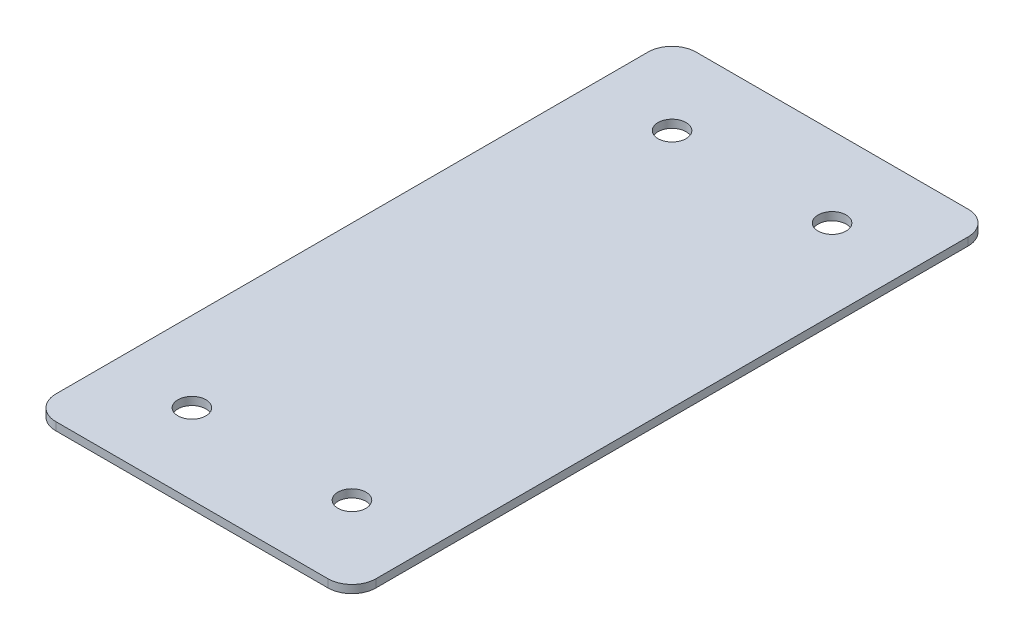
ISO-10303-21;
HEADER;
FILE_DESCRIPTION(('STEP AP214'),'2;1');
FILE_NAME('part.step','',(''),(''),'','','');
FILE_SCHEMA(('AUTOMOTIVE_DESIGN { 1 0 10303 214 1 1 1 1 }'));
ENDSEC;
DATA;
#1=APPLICATION_CONTEXT('core data for automotive mechanical design processes');
#2=APPLICATION_PROTOCOL_DEFINITION('international standard','automotive_design',2000,#1);
#3=PRODUCT_CONTEXT('',#1,'mechanical');
#4=PRODUCT('Part','Part','',(#3));
#5=PRODUCT_RELATED_PRODUCT_CATEGORY('part','',(#4));
#6=PRODUCT_DEFINITION_FORMATION('','',#4);
#7=PRODUCT_DEFINITION_CONTEXT('part definition',#1,'design');
#8=PRODUCT_DEFINITION('design','',#6,#7);
#9=PRODUCT_DEFINITION_SHAPE('','',#8);
#10=(LENGTH_UNIT() NAMED_UNIT(*) SI_UNIT(.MILLI.,.METRE.));
#11=(NAMED_UNIT(*) PLANE_ANGLE_UNIT() SI_UNIT($,.RADIAN.));
#12=(NAMED_UNIT(*) SI_UNIT($,.STERADIAN.) SOLID_ANGLE_UNIT());
#13=UNCERTAINTY_MEASURE_WITH_UNIT(LENGTH_MEASURE(1.E-05),#10,'distance_accuracy_value','');
#14=(GEOMETRIC_REPRESENTATION_CONTEXT(3) GLOBAL_UNCERTAINTY_ASSIGNED_CONTEXT((#13)) GLOBAL_UNIT_ASSIGNED_CONTEXT((#10,
#11,#12)) REPRESENTATION_CONTEXT('',''));
#15=CARTESIAN_POINT('',(0.,0.,0.));
#16=DIRECTION('',(0.,0.,1.));
#17=DIRECTION('',(1.,0.,0.));
#18=AXIS2_PLACEMENT_3D('',#15,#16,#17);
#19=CARTESIAN_POINT('',(0.,1.,0.));
#20=DIRECTION('',(0.,1.,0.));
#21=DIRECTION('',(0.,0.,1.));
#22=AXIS2_PLACEMENT_3D('',#19,#20,#21);
#23=PLANE('',#22);
#24=CARTESIAN_POINT('',(10.2814161229713,1.,30.9206525123638));
#25=DIRECTION('',(0.,1.,0.));
#26=DIRECTION('',(0.,0.,1.));
#27=AXIS2_PLACEMENT_3D('',#24,#25,#26);
#28=CIRCLE('',#27,1.75);
#29=CARTESIAN_POINT('',(10.2814161229713,1.,32.6706525123638));
#30=VERTEX_POINT('',#29);
#31=EDGE_CURVE('E188',#30,#30,#28,.T.);
#32=ORIENTED_EDGE('',*,*,#31,.F.);
#33=EDGE_LOOP('',(#32));
#34=FACE_BOUND('',#33,.T.);
#35=CARTESIAN_POINT('',(-9.71858387702875,1.,-29.0793474876362));
#36=DIRECTION('',(0.,1.,0.));
#37=DIRECTION('',(0.,0.,1.));
#38=AXIS2_PLACEMENT_3D('',#35,#36,#37);
#39=CIRCLE('',#38,1.75);
#40=CARTESIAN_POINT('',(-9.71858387702875,1.,-27.3293474876362));
#41=VERTEX_POINT('',#40);
#42=EDGE_CURVE('E134',#41,#41,#39,.T.);
#43=ORIENTED_EDGE('',*,*,#42,.F.);
#44=EDGE_LOOP('',(#43));
#45=FACE_BOUND('',#44,.T.);
#46=DIRECTION('',(-1.,0.,0.));
#47=VECTOR('',#46,1.);
#48=CARTESIAN_POINT('',(20.2814161229713,1.,-39.0793474876362));
#49=LINE('',#48,#47);
#50=CARTESIAN_POINT('',(17.2814161229713,1.,-39.0793474876362));
#51=VERTEX_POINT('',#50);
#52=CARTESIAN_POINT('',(-16.7185838770287,1.,-39.0793474876362));
#53=VERTEX_POINT('',#52);
#54=EDGE_CURVE('E139',#51,#53,#49,.T.);
#55=ORIENTED_EDGE('',*,*,#54,.T.);
#56=CARTESIAN_POINT('',(-16.7185838770288,1.,-36.0793474876362));
#57=DIRECTION('',(0.,1.,0.));
#58=DIRECTION('',(0.,0.,1.));
#59=AXIS2_PLACEMENT_3D('',#56,#57,#58);
#60=CIRCLE('',#59,3.);
#61=CARTESIAN_POINT('',(-19.7185838770288,1.,-36.0793474876362));
#62=VERTEX_POINT('',#61);
#63=EDGE_CURVE('E154',#53,#62,#60,.T.);
#64=ORIENTED_EDGE('',*,*,#63,.T.);
#65=DIRECTION('',(0.,0.,1.));
#66=VECTOR('',#65,1.);
#67=CARTESIAN_POINT('',(-19.7185838770288,1.,-39.0793474876362));
#68=LINE('',#67,#66);
#69=CARTESIAN_POINT('',(-19.7185838770288,1.,37.9206525123638));
#70=VERTEX_POINT('',#69);
#71=EDGE_CURVE('E121',#62,#70,#68,.T.);
#72=ORIENTED_EDGE('',*,*,#71,.T.);
#73=CARTESIAN_POINT('',(-16.7185838770288,1.,37.9206525123638));
#74=DIRECTION('',(0.,1.,0.));
#75=DIRECTION('',(0.,0.,1.));
#76=AXIS2_PLACEMENT_3D('',#73,#74,#75);
#77=CIRCLE('',#76,3.);
#78=CARTESIAN_POINT('',(-16.7185838770288,1.,40.9206525123638));
#79=VERTEX_POINT('',#78);
#80=EDGE_CURVE('E149',#70,#79,#77,.T.);
#81=ORIENTED_EDGE('',*,*,#80,.T.);
#82=DIRECTION('',(1.,0.,0.));
#83=VECTOR('',#82,1.);
#84=CARTESIAN_POINT('',(-19.7185838770288,1.,40.9206525123638));
#85=LINE('',#84,#83);
#86=CARTESIAN_POINT('',(17.2814161229713,1.,40.9206525123638));
#87=VERTEX_POINT('',#86);
#88=EDGE_CURVE('E165',#79,#87,#85,.T.);
#89=ORIENTED_EDGE('',*,*,#88,.T.);
#90=CARTESIAN_POINT('',(17.2814161229713,1.,37.9206525123638));
#91=DIRECTION('',(0.,1.,0.));
#92=DIRECTION('',(0.,0.,1.));
#93=AXIS2_PLACEMENT_3D('',#90,#91,#92);
#94=CIRCLE('',#93,3.);
#95=CARTESIAN_POINT('',(20.2814161229713,1.,37.9206525123638));
#96=VERTEX_POINT('',#95);
#97=EDGE_CURVE('E57',#87,#96,#94,.T.);
#98=ORIENTED_EDGE('',*,*,#97,.T.);
#99=DIRECTION('',(0.,0.,-1.));
#100=VECTOR('',#99,1.);
#101=CARTESIAN_POINT('',(20.2814161229713,1.,40.9206525123638));
#102=LINE('',#101,#100);
#103=CARTESIAN_POINT('',(20.2814161229713,1.,-36.0793474876362));
#104=VERTEX_POINT('',#103);
#105=EDGE_CURVE('E140',#96,#104,#102,.T.);
#106=ORIENTED_EDGE('',*,*,#105,.T.);
#107=CARTESIAN_POINT('',(17.2814161229713,1.,-36.0793474876362));
#108=DIRECTION('',(0.,1.,0.));
#109=DIRECTION('',(0.,0.,1.));
#110=AXIS2_PLACEMENT_3D('',#107,#108,#109);
#111=CIRCLE('',#110,3.);
#112=EDGE_CURVE('E152',#104,#51,#111,.T.);
#113=ORIENTED_EDGE('',*,*,#112,.T.);
#114=EDGE_LOOP('',(#55,#64,#72,#81,#89,#98,#106,#113));
#115=FACE_BOUND('',#114,.T.);
#116=CARTESIAN_POINT('',(10.2814161229713,1.,-29.0793474876362));
#117=DIRECTION('',(0.,1.,0.));
#118=DIRECTION('',(0.,0.,-1.));
#119=AXIS2_PLACEMENT_3D('',#116,#117,#118);
#120=CIRCLE('',#119,1.75);
#121=CARTESIAN_POINT('',(10.2814161229713,1.,-30.8293474876362));
#122=VERTEX_POINT('',#121);
#123=EDGE_CURVE('E182',#122,#122,#120,.T.);
#124=ORIENTED_EDGE('',*,*,#123,.F.);
#125=EDGE_LOOP('',(#124));
#126=FACE_BOUND('',#125,.T.);
#127=CARTESIAN_POINT('',(-9.71858387702875,1.,30.9206525123638));
#128=DIRECTION('',(0.,1.,0.));
#129=DIRECTION('',(0.,0.,-1.));
#130=AXIS2_PLACEMENT_3D('',#127,#128,#129);
#131=CIRCLE('',#130,1.75);
#132=CARTESIAN_POINT('',(-9.71858387702875,1.,29.1706525123638));
#133=VERTEX_POINT('',#132);
#134=EDGE_CURVE('E194',#133,#133,#131,.T.);
#135=ORIENTED_EDGE('',*,*,#134,.F.);
#136=EDGE_LOOP('',(#135));
#137=FACE_BOUND('',#136,.T.);
#138=ADVANCED_FACE('F35',(#34,#45,#115,#126,#137),#23,.T.);
#139=CARTESIAN_POINT('',(0.,0.,0.));
#140=DIRECTION('',(0.,1.,0.));
#141=DIRECTION('',(0.,0.,1.));
#142=AXIS2_PLACEMENT_3D('',#139,#140,#141);
#143=PLANE('',#142);
#144=DIRECTION('',(0.,0.,1.));
#145=VECTOR('',#144,1.);
#146=CARTESIAN_POINT('',(-19.7185838770288,0.,-39.0793474876362));
#147=LINE('',#146,#145);
#148=CARTESIAN_POINT('',(-19.7185838770288,0.,-36.0793474876362));
#149=VERTEX_POINT('',#148);
#150=CARTESIAN_POINT('',(-19.7185838770288,0.,37.9206525123638));
#151=VERTEX_POINT('',#150);
#152=EDGE_CURVE('E118',#149,#151,#147,.T.);
#153=ORIENTED_EDGE('',*,*,#152,.F.);
#154=CARTESIAN_POINT('',(-16.7185838770288,0.,-36.0793474876362));
#155=DIRECTION('',(0.,1.,0.));
#156=DIRECTION('',(0.,0.,1.));
#157=AXIS2_PLACEMENT_3D('',#154,#155,#156);
#158=CIRCLE('',#157,3.);
#159=CARTESIAN_POINT('',(-16.7185838770287,0.,-39.0793474876362));
#160=VERTEX_POINT('',#159);
#161=EDGE_CURVE('E101',#149,#160,#158,.F.);
#162=ORIENTED_EDGE('',*,*,#161,.T.);
#163=DIRECTION('',(-1.,0.,0.));
#164=VECTOR('',#163,1.);
#165=CARTESIAN_POINT('',(0.281416122971253,0.,-39.0793474876362));
#166=LINE('',#165,#164);
#167=CARTESIAN_POINT('',(17.2814161229712,0.,-39.0793474876362));
#168=VERTEX_POINT('',#167);
#169=EDGE_CURVE('E129',#168,#160,#166,.T.);
#170=ORIENTED_EDGE('',*,*,#169,.F.);
#171=CARTESIAN_POINT('',(17.2814161229713,0.,-36.0793474876362));
#172=DIRECTION('',(0.,1.,0.));
#173=DIRECTION('',(0.,0.,1.));
#174=AXIS2_PLACEMENT_3D('',#171,#172,#173);
#175=CIRCLE('',#174,3.);
#176=CARTESIAN_POINT('',(20.2814161229713,0.,-36.0793474876362));
#177=VERTEX_POINT('',#176);
#178=EDGE_CURVE('E112',#168,#177,#175,.F.);
#179=ORIENTED_EDGE('',*,*,#178,.T.);
#180=DIRECTION('',(0.,0.,-1.));
#181=VECTOR('',#180,1.);
#182=CARTESIAN_POINT('',(20.2814161229713,0.,40.9206525123638));
#183=LINE('',#182,#181);
#184=CARTESIAN_POINT('',(20.2814161229713,0.,37.9206525123638));
#185=VERTEX_POINT('',#184);
#186=EDGE_CURVE('E132',#185,#177,#183,.T.);
#187=ORIENTED_EDGE('',*,*,#186,.F.);
#188=CARTESIAN_POINT('',(17.2814161229713,0.,37.9206525123638));
#189=DIRECTION('',(0.,1.,0.));
#190=DIRECTION('',(0.,0.,1.));
#191=AXIS2_PLACEMENT_3D('',#188,#189,#190);
#192=CIRCLE('',#191,3.);
#193=CARTESIAN_POINT('',(17.2814161229713,0.,40.9206525123638));
#194=VERTEX_POINT('',#193);
#195=EDGE_CURVE('E143',#185,#194,#192,.F.);
#196=ORIENTED_EDGE('',*,*,#195,.T.);
#197=DIRECTION('',(1.,0.,0.));
#198=VECTOR('',#197,1.);
#199=CARTESIAN_POINT('',(-19.7185838770288,0.,40.9206525123638));
#200=LINE('',#199,#198);
#201=CARTESIAN_POINT('',(-16.7185838770288,0.,40.9206525123638));
#202=VERTEX_POINT('',#201);
#203=EDGE_CURVE('E128',#202,#194,#200,.T.);
#204=ORIENTED_EDGE('',*,*,#203,.F.);
#205=CARTESIAN_POINT('',(-16.7185838770288,0.,37.9206525123638));
#206=DIRECTION('',(0.,1.,0.));
#207=DIRECTION('',(0.,0.,1.));
#208=AXIS2_PLACEMENT_3D('',#205,#206,#207);
#209=CIRCLE('',#208,3.);
#210=EDGE_CURVE('E122',#202,#151,#209,.F.);
#211=ORIENTED_EDGE('',*,*,#210,.T.);
#212=EDGE_LOOP('',(#153,#162,#170,#179,#187,#196,#204,#211));
#213=FACE_BOUND('',#212,.T.);
#214=CARTESIAN_POINT('',(-9.71858387702875,0.,-29.0793474876362));
#215=DIRECTION('',(0.,1.,0.));
#216=DIRECTION('',(0.,0.,1.));
#217=AXIS2_PLACEMENT_3D('',#214,#215,#216);
#218=CIRCLE('',#217,1.75);
#219=CARTESIAN_POINT('',(-9.71858387702875,0.,-27.3293474876362));
#220=VERTEX_POINT('',#219);
#221=EDGE_CURVE('E179',#220,#220,#218,.T.);
#222=ORIENTED_EDGE('',*,*,#221,.T.);
#223=EDGE_LOOP('',(#222));
#224=FACE_BOUND('',#223,.T.);
#225=CARTESIAN_POINT('',(10.2814161229713,0.,-29.0793474876362));
#226=DIRECTION('',(0.,1.,0.));
#227=DIRECTION('',(0.,0.,-1.));
#228=AXIS2_PLACEMENT_3D('',#225,#226,#227);
#229=CIRCLE('',#228,1.75);
#230=CARTESIAN_POINT('',(10.2814161229713,0.,-30.8293474876362));
#231=VERTEX_POINT('',#230);
#232=EDGE_CURVE('E185',#231,#231,#229,.T.);
#233=ORIENTED_EDGE('',*,*,#232,.T.);
#234=EDGE_LOOP('',(#233));
#235=FACE_BOUND('',#234,.T.);
#236=CARTESIAN_POINT('',(10.2814161229713,0.,30.9206525123638));
#237=DIRECTION('',(0.,1.,0.));
#238=DIRECTION('',(0.,0.,1.));
#239=AXIS2_PLACEMENT_3D('',#236,#237,#238);
#240=CIRCLE('',#239,1.75);
#241=CARTESIAN_POINT('',(10.2814161229713,0.,32.6706525123638));
#242=VERTEX_POINT('',#241);
#243=EDGE_CURVE('E191',#242,#242,#240,.T.);
#244=ORIENTED_EDGE('',*,*,#243,.T.);
#245=EDGE_LOOP('',(#244));
#246=FACE_BOUND('',#245,.T.);
#247=CARTESIAN_POINT('',(-9.71858387702875,0.,30.9206525123638));
#248=DIRECTION('',(0.,1.,0.));
#249=DIRECTION('',(0.,0.,-1.));
#250=AXIS2_PLACEMENT_3D('',#247,#248,#249);
#251=CIRCLE('',#250,1.75);
#252=CARTESIAN_POINT('',(-9.71858387702875,0.,29.1706525123638));
#253=VERTEX_POINT('',#252);
#254=EDGE_CURVE('E197',#253,#253,#251,.T.);
#255=ORIENTED_EDGE('',*,*,#254,.T.);
#256=EDGE_LOOP('',(#255));
#257=FACE_BOUND('',#256,.T.);
#258=ADVANCED_FACE('F125',(#213,#224,#235,#246,#257),#143,.F.);
#259=CARTESIAN_POINT('',(0.281416122971253,1.,-39.0793474876362));
#260=DIRECTION('',(0.,0.,1.));
#261=DIRECTION('',(1.,0.,0.));
#262=AXIS2_PLACEMENT_3D('',#259,#260,#261);
#263=PLANE('',#262);
#264=ORIENTED_EDGE('',*,*,#169,.T.);
#265=DIRECTION('',(0.,-1.,0.));
#266=VECTOR('',#265,1.);
#267=CARTESIAN_POINT('',(-16.7185838770288,1.,-39.0793474876362));
#268=LINE('',#267,#266);
#269=EDGE_CURVE('E106',#160,#53,#268,.F.);
#270=ORIENTED_EDGE('',*,*,#269,.T.);
#271=ORIENTED_EDGE('',*,*,#54,.F.);
#272=DIRECTION('',(0.,-1.,0.));
#273=VECTOR('',#272,1.);
#274=CARTESIAN_POINT('',(17.2814161229713,1.,-39.0793474876362));
#275=LINE('',#274,#273);
#276=EDGE_CURVE('E111',#51,#168,#275,.T.);
#277=ORIENTED_EDGE('',*,*,#276,.T.);
#278=EDGE_LOOP('',(#264,#270,#271,#277));
#279=FACE_BOUND('',#278,.T.);
#280=ADVANCED_FACE('F212',(#279),#263,.F.);
#281=CARTESIAN_POINT('',(-19.7185838770288,1.,-39.0793474876362));
#282=DIRECTION('',(1.,0.,0.));
#283=DIRECTION('',(0.,0.,-1.));
#284=AXIS2_PLACEMENT_3D('',#281,#282,#283);
#285=PLANE('',#284);
#286=ORIENTED_EDGE('',*,*,#71,.F.);
#287=DIRECTION('',(0.,-1.,0.));
#288=VECTOR('',#287,1.);
#289=CARTESIAN_POINT('',(-19.7185838770288,1.,-36.0793474876362));
#290=LINE('',#289,#288);
#291=EDGE_CURVE('E105',#62,#149,#290,.T.);
#292=ORIENTED_EDGE('',*,*,#291,.T.);
#293=ORIENTED_EDGE('',*,*,#152,.T.);
#294=DIRECTION('',(0.,-1.,0.));
#295=VECTOR('',#294,1.);
#296=CARTESIAN_POINT('',(-19.7185838770288,1.,37.9206525123638));
#297=LINE('',#296,#295);
#298=EDGE_CURVE('E123',#151,#70,#297,.F.);
#299=ORIENTED_EDGE('',*,*,#298,.T.);
#300=EDGE_LOOP('',(#286,#292,#293,#299));
#301=FACE_BOUND('',#300,.T.);
#302=ADVANCED_FACE('F117',(#301),#285,.F.);
#303=CARTESIAN_POINT('',(-19.7185838770288,1.,40.9206525123638));
#304=DIRECTION('',(0.,0.,-1.));
#305=DIRECTION('',(-1.,0.,0.));
#306=AXIS2_PLACEMENT_3D('',#303,#304,#305);
#307=PLANE('',#306);
#308=ORIENTED_EDGE('',*,*,#203,.T.);
#309=DIRECTION('',(0.,-1.,0.));
#310=VECTOR('',#309,1.);
#311=CARTESIAN_POINT('',(17.2814161229713,1.,40.9206525123638));
#312=LINE('',#311,#310);
#313=EDGE_CURVE('E11',#194,#87,#312,.F.);
#314=ORIENTED_EDGE('',*,*,#313,.T.);
#315=ORIENTED_EDGE('',*,*,#88,.F.);
#316=DIRECTION('',(0.,-1.,0.));
#317=VECTOR('',#316,1.);
#318=CARTESIAN_POINT('',(-16.7185838770288,1.,40.9206525123638));
#319=LINE('',#318,#317);
#320=EDGE_CURVE('E43',#79,#202,#319,.T.);
#321=ORIENTED_EDGE('',*,*,#320,.T.);
#322=EDGE_LOOP('',(#308,#314,#315,#321));
#323=FACE_BOUND('',#322,.T.);
#324=ADVANCED_FACE('F163',(#323),#307,.F.);
#325=CARTESIAN_POINT('',(20.2814161229713,1.,40.9206525123638));
#326=DIRECTION('',(-1.,0.,0.));
#327=DIRECTION('',(0.,0.,1.));
#328=AXIS2_PLACEMENT_3D('',#325,#326,#327);
#329=PLANE('',#328);
#330=ORIENTED_EDGE('',*,*,#186,.T.);
#331=DIRECTION('',(0.,-1.,0.));
#332=VECTOR('',#331,1.);
#333=CARTESIAN_POINT('',(20.2814161229713,1.,-36.0793474876362));
#334=LINE('',#333,#332);
#335=EDGE_CURVE('E50',#177,#104,#334,.F.);
#336=ORIENTED_EDGE('',*,*,#335,.T.);
#337=ORIENTED_EDGE('',*,*,#105,.F.);
#338=DIRECTION('',(0.,-1.,0.));
#339=VECTOR('',#338,1.);
#340=CARTESIAN_POINT('',(20.2814161229713,1.,37.9206525123638));
#341=LINE('',#340,#339);
#342=EDGE_CURVE('E156',#96,#185,#341,.T.);
#343=ORIENTED_EDGE('',*,*,#342,.T.);
#344=EDGE_LOOP('',(#330,#336,#337,#343));
#345=FACE_BOUND('',#344,.T.);
#346=ADVANCED_FACE('F172',(#345),#329,.F.);
#347=CARTESIAN_POINT('',(-9.71858387702875,1.,-29.0793474876362));
#348=DIRECTION('',(0.,-1.,0.));
#349=DIRECTION('',(0.,0.,-1.));
#350=AXIS2_PLACEMENT_3D('',#347,#348,#349);
#351=CYLINDRICAL_SURFACE('',#350,1.75);
#352=ORIENTED_EDGE('',*,*,#42,.T.);
#353=EDGE_LOOP('',(#352));
#354=FACE_BOUND('',#353,.T.);
#355=ORIENTED_EDGE('',*,*,#221,.F.);
#356=EDGE_LOOP('',(#355));
#357=FACE_BOUND('',#356,.T.);
#358=ADVANCED_FACE('F217',(#354,#357),#351,.F.);
#359=CARTESIAN_POINT('',(10.2814161229713,1.,-29.0793474876362));
#360=DIRECTION('',(0.,-1.,0.));
#361=DIRECTION('',(0.,0.,-1.));
#362=AXIS2_PLACEMENT_3D('',#359,#360,#361);
#363=CYLINDRICAL_SURFACE('',#362,1.75);
#364=ORIENTED_EDGE('',*,*,#123,.T.);
#365=EDGE_LOOP('',(#364));
#366=FACE_BOUND('',#365,.T.);
#367=ORIENTED_EDGE('',*,*,#232,.F.);
#368=EDGE_LOOP('',(#367));
#369=FACE_BOUND('',#368,.T.);
#370=ADVANCED_FACE('F245',(#366,#369),#363,.F.);
#371=CARTESIAN_POINT('',(10.2814161229713,1.,30.9206525123638));
#372=DIRECTION('',(0.,-1.,0.));
#373=DIRECTION('',(0.,0.,-1.));
#374=AXIS2_PLACEMENT_3D('',#371,#372,#373);
#375=CYLINDRICAL_SURFACE('',#374,1.75);
#376=ORIENTED_EDGE('',*,*,#31,.T.);
#377=EDGE_LOOP('',(#376));
#378=FACE_BOUND('',#377,.T.);
#379=ORIENTED_EDGE('',*,*,#243,.F.);
#380=EDGE_LOOP('',(#379));
#381=FACE_BOUND('',#380,.T.);
#382=ADVANCED_FACE('F248',(#378,#381),#375,.F.);
#383=CARTESIAN_POINT('',(-9.71858387702875,1.,30.9206525123638));
#384=DIRECTION('',(0.,-1.,0.));
#385=DIRECTION('',(0.,0.,-1.));
#386=AXIS2_PLACEMENT_3D('',#383,#384,#385);
#387=CYLINDRICAL_SURFACE('',#386,1.75);
#388=ORIENTED_EDGE('',*,*,#134,.T.);
#389=EDGE_LOOP('',(#388));
#390=FACE_BOUND('',#389,.T.);
#391=ORIENTED_EDGE('',*,*,#254,.F.);
#392=EDGE_LOOP('',(#391));
#393=FACE_BOUND('',#392,.T.);
#394=ADVANCED_FACE('F203',(#390,#393),#387,.F.);
#395=CARTESIAN_POINT('',(-16.7185838770288,1.,-36.0793474876362));
#396=DIRECTION('',(0.,-1.,0.));
#397=DIRECTION('',(0.,0.,-1.));
#398=AXIS2_PLACEMENT_3D('',#395,#396,#397);
#399=CYLINDRICAL_SURFACE('',#398,3.);
#400=ORIENTED_EDGE('',*,*,#63,.F.);
#401=ORIENTED_EDGE('',*,*,#269,.F.);
#402=ORIENTED_EDGE('',*,*,#161,.F.);
#403=ORIENTED_EDGE('',*,*,#291,.F.);
#404=EDGE_LOOP('',(#400,#401,#402,#403));
#405=FACE_BOUND('',#404,.T.);
#406=ADVANCED_FACE('F104',(#405),#399,.T.);
#407=CARTESIAN_POINT('',(17.2814161229713,1.,-36.0793474876362));
#408=DIRECTION('',(0.,-1.,0.));
#409=DIRECTION('',(0.,0.,-1.));
#410=AXIS2_PLACEMENT_3D('',#407,#408,#409);
#411=CYLINDRICAL_SURFACE('',#410,3.);
#412=ORIENTED_EDGE('',*,*,#112,.F.);
#413=ORIENTED_EDGE('',*,*,#335,.F.);
#414=ORIENTED_EDGE('',*,*,#178,.F.);
#415=ORIENTED_EDGE('',*,*,#276,.F.);
#416=EDGE_LOOP('',(#412,#413,#414,#415));
#417=FACE_BOUND('',#416,.T.);
#418=ADVANCED_FACE('F231',(#417),#411,.T.);
#419=CARTESIAN_POINT('',(17.2814161229713,1.,37.9206525123638));
#420=DIRECTION('',(0.,-1.,0.));
#421=DIRECTION('',(0.,0.,-1.));
#422=AXIS2_PLACEMENT_3D('',#419,#420,#421);
#423=CYLINDRICAL_SURFACE('',#422,3.);
#424=ORIENTED_EDGE('',*,*,#97,.F.);
#425=ORIENTED_EDGE('',*,*,#313,.F.);
#426=ORIENTED_EDGE('',*,*,#195,.F.);
#427=ORIENTED_EDGE('',*,*,#342,.F.);
#428=EDGE_LOOP('',(#424,#425,#426,#427));
#429=FACE_BOUND('',#428,.T.);
#430=ADVANCED_FACE('F171',(#429),#423,.T.);
#431=CARTESIAN_POINT('',(-16.7185838770288,1.,37.9206525123638));
#432=DIRECTION('',(0.,-1.,0.));
#433=DIRECTION('',(0.,0.,-1.));
#434=AXIS2_PLACEMENT_3D('',#431,#432,#433);
#435=CYLINDRICAL_SURFACE('',#434,3.);
#436=ORIENTED_EDGE('',*,*,#80,.F.);
#437=ORIENTED_EDGE('',*,*,#298,.F.);
#438=ORIENTED_EDGE('',*,*,#210,.F.);
#439=ORIENTED_EDGE('',*,*,#320,.F.);
#440=EDGE_LOOP('',(#436,#437,#438,#439));
#441=FACE_BOUND('',#440,.T.);
#442=ADVANCED_FACE('F37',(#441),#435,.T.);
#443=CLOSED_SHELL('',(#138,#258,#280,#302,#324,#346,#358,#370,#382,#394,#406,#418,#430,#442));
#444=MANIFOLD_SOLID_BREP('B2',#443);
#445=ADVANCED_BREP_SHAPE_REPRESENTATION('',(#18,#444),#14);
#446=SHAPE_DEFINITION_REPRESENTATION(#9,#445);
ENDSEC;
END-ISO-10303-21;
